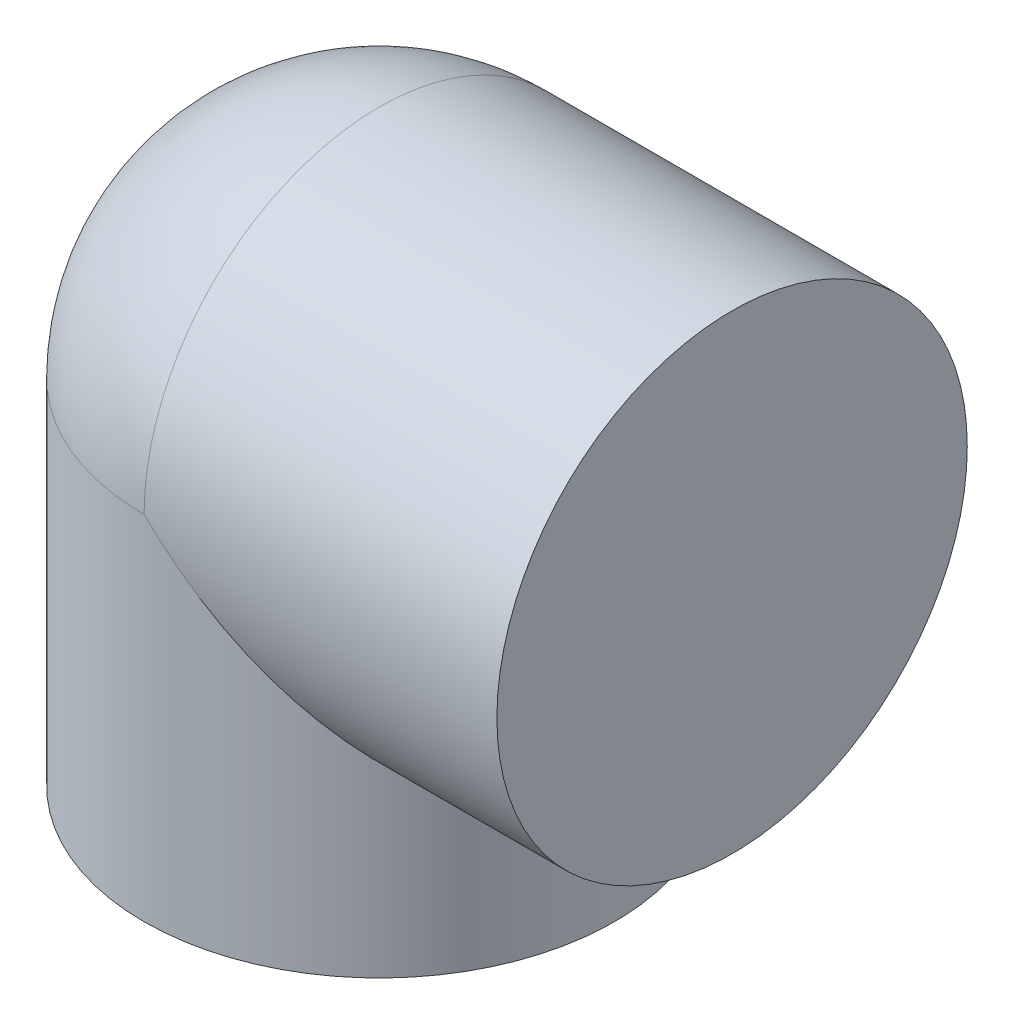
ISO-10303-21;
HEADER;
FILE_DESCRIPTION(('STEP AP214'),'2;1');
FILE_NAME('part.step','',(''),(''),'','','');
FILE_SCHEMA(('AUTOMOTIVE_DESIGN { 1 0 10303 214 1 1 1 1 }'));
ENDSEC;
DATA;
#1=APPLICATION_CONTEXT('core data for automotive mechanical design processes');
#2=APPLICATION_PROTOCOL_DEFINITION('international standard','automotive_design',2000,#1);
#3=PRODUCT_CONTEXT('',#1,'mechanical');
#4=PRODUCT('Part','Part','',(#3));
#5=PRODUCT_RELATED_PRODUCT_CATEGORY('part','',(#4));
#6=PRODUCT_DEFINITION_FORMATION('','',#4);
#7=PRODUCT_DEFINITION_CONTEXT('part definition',#1,'design');
#8=PRODUCT_DEFINITION('design','',#6,#7);
#9=PRODUCT_DEFINITION_SHAPE('','',#8);
#10=(LENGTH_UNIT() NAMED_UNIT(*) SI_UNIT(.MILLI.,.METRE.));
#11=(NAMED_UNIT(*) PLANE_ANGLE_UNIT() SI_UNIT($,.RADIAN.));
#12=(NAMED_UNIT(*) SI_UNIT($,.STERADIAN.) SOLID_ANGLE_UNIT());
#13=UNCERTAINTY_MEASURE_WITH_UNIT(LENGTH_MEASURE(1.E-05),#10,'distance_accuracy_value','');
#14=(GEOMETRIC_REPRESENTATION_CONTEXT(3) GLOBAL_UNCERTAINTY_ASSIGNED_CONTEXT((#13)) GLOBAL_UNIT_ASSIGNED_CONTEXT((#10,
#11,#12)) REPRESENTATION_CONTEXT('',''));
#15=CARTESIAN_POINT('',(0.,0.,0.));
#16=DIRECTION('',(0.,0.,1.));
#17=DIRECTION('',(1.,0.,0.));
#18=AXIS2_PLACEMENT_3D('',#15,#16,#17);
#19=CARTESIAN_POINT('',(30.,80.,0.));
#20=DIRECTION('',(-1.,0.,0.));
#21=DIRECTION('',(0.,0.,1.));
#22=AXIS2_PLACEMENT_3D('',#19,#20,#21);
#23=CYLINDRICAL_SURFACE('',#22,20.);
#24=CARTESIAN_POINT('',(30.,80.,0.));
#25=DIRECTION('',(1.,0.,0.));
#26=DIRECTION('',(0.,0.,-1.));
#27=AXIS2_PLACEMENT_3D('',#24,#25,#26);
#28=CIRCLE('',#27,20.);
#29=CARTESIAN_POINT('',(30.,80.,-20.));
#30=VERTEX_POINT('',#29);
#31=EDGE_CURVE('E80',#30,#30,#28,.T.);
#32=ORIENTED_EDGE('',*,*,#31,.F.);
#33=EDGE_LOOP('',(#32));
#34=FACE_BOUND('',#33,.T.);
#35=CARTESIAN_POINT('',(0.,80.,0.));
#36=DIRECTION('',(-0.707106781186547,-0.707106781186547,0.));
#37=DIRECTION('',(-0.707106781186547,0.707106781186547,0.));
#38=AXIS2_PLACEMENT_3D('',#35,#36,#37);
#39=ELLIPSE('',#38,28.2842712474619,20.);
#40=CARTESIAN_POINT('',(0.,80.,-20.));
#41=VERTEX_POINT('',#40);
#42=CARTESIAN_POINT('',(0.,80.,20.));
#43=VERTEX_POINT('',#42);
#44=EDGE_CURVE('E12',#41,#43,#39,.T.);
#45=ORIENTED_EDGE('',*,*,#44,.F.);
#46=CARTESIAN_POINT('',(0.,80.,0.));
#47=DIRECTION('',(-1.,0.,0.));
#48=DIRECTION('',(0.,0.,1.));
#49=AXIS2_PLACEMENT_3D('',#46,#47,#48);
#50=CIRCLE('',#49,20.);
#51=EDGE_CURVE('E54',#41,#43,#50,.F.);
#52=ORIENTED_EDGE('',*,*,#51,.T.);
#53=EDGE_LOOP('',(#45,#52));
#54=FACE_BOUND('',#53,.T.);
#55=ADVANCED_FACE('F37',(#34,#54),#23,.T.);
#56=CARTESIAN_POINT('',(0.,100.,0.));
#57=DIRECTION('',(0.,-1.,0.));
#58=DIRECTION('',(0.,0.,-1.));
#59=AXIS2_PLACEMENT_3D('',#56,#57,#58);
#60=CYLINDRICAL_SURFACE('',#59,20.);
#61=CARTESIAN_POINT('',(0.,50.,0.));
#62=DIRECTION('',(0.,1.,0.));
#63=DIRECTION('',(0.,0.,1.));
#64=AXIS2_PLACEMENT_3D('',#61,#62,#63);
#65=CIRCLE('',#64,20.);
#66=CARTESIAN_POINT('',(0.,50.,20.));
#67=VERTEX_POINT('',#66);
#68=EDGE_CURVE('E56',#67,#67,#65,.T.);
#69=ORIENTED_EDGE('',*,*,#68,.T.);
#70=EDGE_LOOP('',(#69));
#71=FACE_BOUND('',#70,.T.);
#72=ORIENTED_EDGE('',*,*,#44,.T.);
#73=CARTESIAN_POINT('',(0.,80.,0.));
#74=DIRECTION('',(0.,-1.,0.));
#75=DIRECTION('',(0.,0.,-1.));
#76=AXIS2_PLACEMENT_3D('',#73,#74,#75);
#77=CIRCLE('',#76,20.);
#78=EDGE_CURVE('E45',#43,#41,#77,.T.);
#79=ORIENTED_EDGE('',*,*,#78,.T.);
#80=EDGE_LOOP('',(#72,#79));
#81=FACE_BOUND('',#80,.T.);
#82=ADVANCED_FACE('F58',(#71,#81),#60,.T.);
#83=CARTESIAN_POINT('',(0.,50.,0.));
#84=DIRECTION('',(0.,1.,0.));
#85=DIRECTION('',(0.,0.,1.));
#86=AXIS2_PLACEMENT_3D('',#83,#84,#85);
#87=PLANE('',#86);
#88=ORIENTED_EDGE('',*,*,#68,.F.);
#89=EDGE_LOOP('',(#88));
#90=FACE_BOUND('',#89,.T.);
#91=ADVANCED_FACE('F60',(#90),#87,.F.);
#92=CARTESIAN_POINT('',(0.,80.,0.));
#93=DIRECTION('',(0.,1.,0.));
#94=DIRECTION('',(0.,0.,1.));
#95=AXIS2_PLACEMENT_3D('',#92,#93,#94);
#96=SPHERICAL_SURFACE('',#95,20.);
#97=ORIENTED_EDGE('',*,*,#51,.F.);
#98=ORIENTED_EDGE('',*,*,#78,.F.);
#99=EDGE_LOOP('',(#97,#98));
#100=FACE_BOUND('',#99,.T.);
#101=ADVANCED_FACE('F39',(#100),#96,.T.);
#102=CARTESIAN_POINT('',(30.,80.,0.));
#103=DIRECTION('',(1.,0.,0.));
#104=DIRECTION('',(0.,0.,-1.));
#105=AXIS2_PLACEMENT_3D('',#102,#103,#104);
#106=PLANE('',#105);
#107=ORIENTED_EDGE('',*,*,#31,.T.);
#108=EDGE_LOOP('',(#107));
#109=FACE_BOUND('',#108,.T.);
#110=ADVANCED_FACE('F72',(#109),#106,.T.);
#111=CLOSED_SHELL('',(#55,#82,#91,#101,#110));
#112=MANIFOLD_SOLID_BREP('B2',#111);
#113=ADVANCED_BREP_SHAPE_REPRESENTATION('',(#18,#112),#14);
#114=SHAPE_DEFINITION_REPRESENTATION(#9,#113);
ENDSEC;
END-ISO-10303-21;
